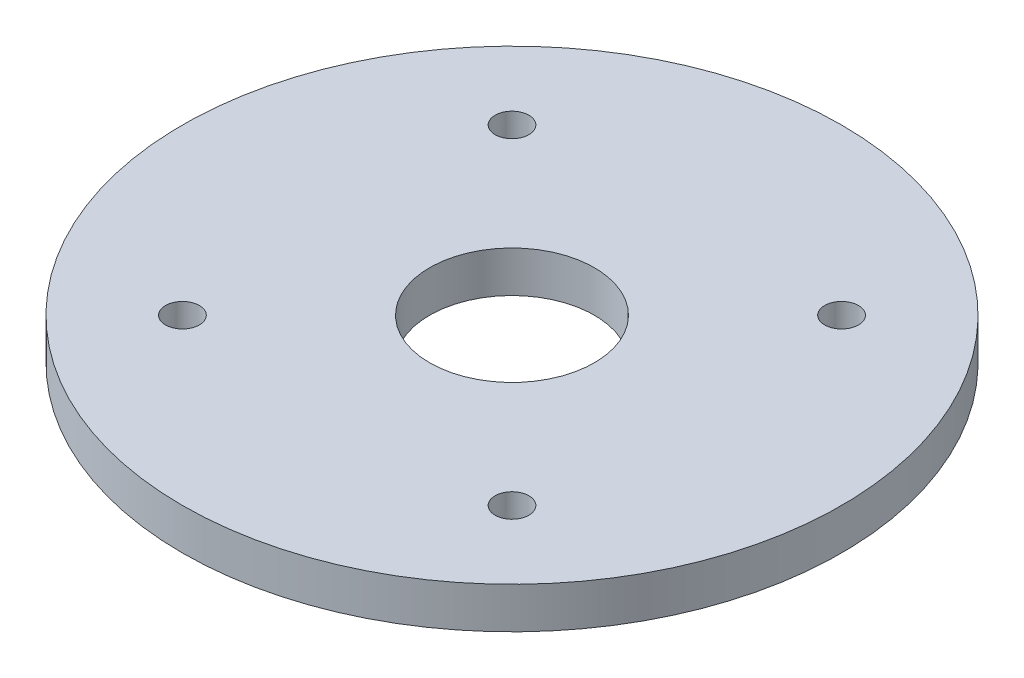
ISO-10303-21;
HEADER;
FILE_DESCRIPTION(('STEP AP214'),'2;1');
FILE_NAME('part.step','',(''),(''),'','','');
FILE_SCHEMA(('AUTOMOTIVE_DESIGN { 1 0 10303 214 1 1 1 1 }'));
ENDSEC;
DATA;
#1=APPLICATION_CONTEXT('core data for automotive mechanical design processes');
#2=APPLICATION_PROTOCOL_DEFINITION('international standard','automotive_design',2000,#1);
#3=PRODUCT_CONTEXT('',#1,'mechanical');
#4=PRODUCT('Part','Part','',(#3));
#5=PRODUCT_RELATED_PRODUCT_CATEGORY('part','',(#4));
#6=PRODUCT_DEFINITION_FORMATION('','',#4);
#7=PRODUCT_DEFINITION_CONTEXT('part definition',#1,'design');
#8=PRODUCT_DEFINITION('design','',#6,#7);
#9=PRODUCT_DEFINITION_SHAPE('','',#8);
#10=(LENGTH_UNIT() NAMED_UNIT(*) SI_UNIT(.MILLI.,.METRE.));
#11=(NAMED_UNIT(*) PLANE_ANGLE_UNIT() SI_UNIT($,.RADIAN.));
#12=(NAMED_UNIT(*) SI_UNIT($,.STERADIAN.) SOLID_ANGLE_UNIT());
#13=UNCERTAINTY_MEASURE_WITH_UNIT(LENGTH_MEASURE(1.E-05),#10,'distance_accuracy_value','');
#14=(GEOMETRIC_REPRESENTATION_CONTEXT(3) GLOBAL_UNCERTAINTY_ASSIGNED_CONTEXT((#13)) GLOBAL_UNIT_ASSIGNED_CONTEXT((#10,
#11,#12)) REPRESENTATION_CONTEXT('',''));
#15=CARTESIAN_POINT('',(0.,0.,0.));
#16=DIRECTION('',(0.,0.,1.));
#17=DIRECTION('',(1.,0.,0.));
#18=AXIS2_PLACEMENT_3D('',#15,#16,#17);
#19=CARTESIAN_POINT('',(0.,2.5,0.));
#20=DIRECTION('',(0.,1.,0.));
#21=DIRECTION('',(0.,0.,1.));
#22=AXIS2_PLACEMENT_3D('',#19,#20,#21);
#23=PLANE('',#22);
#24=CARTESIAN_POINT('',(-10.,2.5,-10.));
#25=DIRECTION('',(0.,1.,0.));
#26=DIRECTION('',(0.,0.,1.));
#27=AXIS2_PLACEMENT_3D('',#24,#25,#26);
#28=CIRCLE('',#27,1.025);
#29=CARTESIAN_POINT('',(-10.,2.5,-8.975));
#30=VERTEX_POINT('',#29);
#31=EDGE_CURVE('E73',#30,#30,#28,.T.);
#32=ORIENTED_EDGE('',*,*,#31,.F.);
#33=EDGE_LOOP('',(#32));
#34=FACE_BOUND('',#33,.T.);
#35=CARTESIAN_POINT('',(10.,2.5,-10.));
#36=DIRECTION('',(0.,1.,0.));
#37=DIRECTION('',(0.,0.,1.));
#38=AXIS2_PLACEMENT_3D('',#35,#36,#37);
#39=CIRCLE('',#38,1.025);
#40=CARTESIAN_POINT('',(10.,2.5,-8.975));
#41=VERTEX_POINT('',#40);
#42=EDGE_CURVE('E67',#41,#41,#39,.T.);
#43=ORIENTED_EDGE('',*,*,#42,.F.);
#44=EDGE_LOOP('',(#43));
#45=FACE_BOUND('',#44,.T.);
#46=CARTESIAN_POINT('',(10.,2.5,10.));
#47=DIRECTION('',(0.,1.,0.));
#48=DIRECTION('',(0.,0.,1.));
#49=AXIS2_PLACEMENT_3D('',#46,#47,#48);
#50=CIRCLE('',#49,1.025);
#51=CARTESIAN_POINT('',(10.,2.5,11.025));
#52=VERTEX_POINT('',#51);
#53=EDGE_CURVE('E61',#52,#52,#50,.T.);
#54=ORIENTED_EDGE('',*,*,#53,.F.);
#55=EDGE_LOOP('',(#54));
#56=FACE_BOUND('',#55,.T.);
#57=CARTESIAN_POINT('',(-10.,2.5,10.));
#58=DIRECTION('',(0.,1.,0.));
#59=DIRECTION('',(0.,0.,1.));
#60=AXIS2_PLACEMENT_3D('',#57,#58,#59);
#61=CIRCLE('',#60,1.025);
#62=CARTESIAN_POINT('',(-10.,2.5,11.025));
#63=VERTEX_POINT('',#62);
#64=EDGE_CURVE('E55',#63,#63,#61,.T.);
#65=ORIENTED_EDGE('',*,*,#64,.F.);
#66=EDGE_LOOP('',(#65));
#67=FACE_BOUND('',#66,.T.);
#68=CARTESIAN_POINT('',(0.,2.5,0.));
#69=DIRECTION('',(0.,1.,0.));
#70=DIRECTION('',(0.,0.,1.));
#71=AXIS2_PLACEMENT_3D('',#68,#69,#70);
#72=CIRCLE('',#71,20.);
#73=CARTESIAN_POINT('',(0.,2.5,20.));
#74=VERTEX_POINT('',#73);
#75=EDGE_CURVE('E10',#74,#74,#72,.T.);
#76=ORIENTED_EDGE('',*,*,#75,.T.);
#77=EDGE_LOOP('',(#76));
#78=FACE_BOUND('',#77,.T.);
#79=CARTESIAN_POINT('',(0.,2.5,0.));
#80=DIRECTION('',(0.,1.,0.));
#81=DIRECTION('',(0.,0.,1.));
#82=AXIS2_PLACEMENT_3D('',#79,#80,#81);
#83=CIRCLE('',#82,5.);
#84=CARTESIAN_POINT('',(0.,2.5,5.));
#85=VERTEX_POINT('',#84);
#86=EDGE_CURVE('E45',#85,#85,#83,.T.);
#87=ORIENTED_EDGE('',*,*,#86,.F.);
#88=EDGE_LOOP('',(#87));
#89=FACE_BOUND('',#88,.T.);
#90=ADVANCED_FACE('F34',(#34,#45,#56,#67,#78,#89),#23,.T.);
#91=CARTESIAN_POINT('',(0.,0.,0.));
#92=DIRECTION('',(0.,1.,0.));
#93=DIRECTION('',(0.,0.,1.));
#94=AXIS2_PLACEMENT_3D('',#91,#92,#93);
#95=PLANE('',#94);
#96=CARTESIAN_POINT('',(-10.,0.,-10.));
#97=DIRECTION('',(0.,1.,0.));
#98=DIRECTION('',(0.,0.,1.));
#99=AXIS2_PLACEMENT_3D('',#96,#97,#98);
#100=CIRCLE('',#99,1.025);
#101=CARTESIAN_POINT('',(-10.,0.,-8.975));
#102=VERTEX_POINT('',#101);
#103=EDGE_CURVE('E70',#102,#102,#100,.T.);
#104=ORIENTED_EDGE('',*,*,#103,.T.);
#105=EDGE_LOOP('',(#104));
#106=FACE_BOUND('',#105,.T.);
#107=CARTESIAN_POINT('',(10.,0.,-10.));
#108=DIRECTION('',(0.,1.,0.));
#109=DIRECTION('',(0.,0.,1.));
#110=AXIS2_PLACEMENT_3D('',#107,#108,#109);
#111=CIRCLE('',#110,1.025);
#112=CARTESIAN_POINT('',(10.,0.,-8.975));
#113=VERTEX_POINT('',#112);
#114=EDGE_CURVE('E64',#113,#113,#111,.T.);
#115=ORIENTED_EDGE('',*,*,#114,.T.);
#116=EDGE_LOOP('',(#115));
#117=FACE_BOUND('',#116,.T.);
#118=CARTESIAN_POINT('',(10.,0.,10.));
#119=DIRECTION('',(0.,1.,0.));
#120=DIRECTION('',(0.,0.,1.));
#121=AXIS2_PLACEMENT_3D('',#118,#119,#120);
#122=CIRCLE('',#121,1.025);
#123=CARTESIAN_POINT('',(10.,0.,11.025));
#124=VERTEX_POINT('',#123);
#125=EDGE_CURVE('E58',#124,#124,#122,.T.);
#126=ORIENTED_EDGE('',*,*,#125,.T.);
#127=EDGE_LOOP('',(#126));
#128=FACE_BOUND('',#127,.T.);
#129=CARTESIAN_POINT('',(-10.,0.,10.));
#130=DIRECTION('',(0.,1.,0.));
#131=DIRECTION('',(0.,0.,1.));
#132=AXIS2_PLACEMENT_3D('',#129,#130,#131);
#133=CIRCLE('',#132,1.025);
#134=CARTESIAN_POINT('',(-10.,0.,11.025));
#135=VERTEX_POINT('',#134);
#136=EDGE_CURVE('E50',#135,#135,#133,.T.);
#137=ORIENTED_EDGE('',*,*,#136,.T.);
#138=EDGE_LOOP('',(#137));
#139=FACE_BOUND('',#138,.T.);
#140=CARTESIAN_POINT('',(0.,0.,0.));
#141=DIRECTION('',(0.,1.,0.));
#142=DIRECTION('',(0.,0.,1.));
#143=AXIS2_PLACEMENT_3D('',#140,#141,#142);
#144=CIRCLE('',#143,20.);
#145=CARTESIAN_POINT('',(0.,0.,20.));
#146=VERTEX_POINT('',#145);
#147=EDGE_CURVE('E38',#146,#146,#144,.T.);
#148=ORIENTED_EDGE('',*,*,#147,.F.);
#149=EDGE_LOOP('',(#148));
#150=FACE_BOUND('',#149,.T.);
#151=CARTESIAN_POINT('',(0.,0.,0.));
#152=DIRECTION('',(0.,1.,0.));
#153=DIRECTION('',(0.,0.,1.));
#154=AXIS2_PLACEMENT_3D('',#151,#152,#153);
#155=CIRCLE('',#154,5.);
#156=CARTESIAN_POINT('',(0.,0.,5.));
#157=VERTEX_POINT('',#156);
#158=EDGE_CURVE('E47',#157,#157,#155,.T.);
#159=ORIENTED_EDGE('',*,*,#158,.T.);
#160=EDGE_LOOP('',(#159));
#161=FACE_BOUND('',#160,.T.);
#162=ADVANCED_FACE('F81',(#106,#117,#128,#139,#150,#161),#95,.F.);
#163=CARTESIAN_POINT('',(0.,2.5,0.));
#164=DIRECTION('',(0.,-1.,0.));
#165=DIRECTION('',(0.,0.,-1.));
#166=AXIS2_PLACEMENT_3D('',#163,#164,#165);
#167=CYLINDRICAL_SURFACE('',#166,20.);
#168=ORIENTED_EDGE('',*,*,#75,.F.);
#169=EDGE_LOOP('',(#168));
#170=FACE_BOUND('',#169,.T.);
#171=ORIENTED_EDGE('',*,*,#147,.T.);
#172=EDGE_LOOP('',(#171));
#173=FACE_BOUND('',#172,.T.);
#174=ADVANCED_FACE('F36',(#170,#173),#167,.T.);
#175=CARTESIAN_POINT('',(0.,2.5,0.));
#176=DIRECTION('',(0.,-1.,0.));
#177=DIRECTION('',(0.,0.,-1.));
#178=AXIS2_PLACEMENT_3D('',#175,#176,#177);
#179=CYLINDRICAL_SURFACE('',#178,5.);
#180=ORIENTED_EDGE('',*,*,#86,.T.);
#181=EDGE_LOOP('',(#180));
#182=FACE_BOUND('',#181,.T.);
#183=ORIENTED_EDGE('',*,*,#158,.F.);
#184=EDGE_LOOP('',(#183));
#185=FACE_BOUND('',#184,.T.);
#186=ADVANCED_FACE('F91',(#182,#185),#179,.F.);
#187=CARTESIAN_POINT('',(-10.,2.5,10.));
#188=DIRECTION('',(0.,1.,0.));
#189=DIRECTION('',(0.,0.,1.));
#190=AXIS2_PLACEMENT_3D('',#187,#188,#189);
#191=CYLINDRICAL_SURFACE('',#190,1.025);
#192=ORIENTED_EDGE('',*,*,#136,.F.);
#193=EDGE_LOOP('',(#192));
#194=FACE_BOUND('',#193,.T.);
#195=ORIENTED_EDGE('',*,*,#64,.T.);
#196=EDGE_LOOP('',(#195));
#197=FACE_BOUND('',#196,.T.);
#198=ADVANCED_FACE('F94',(#194,#197),#191,.F.);
#199=CARTESIAN_POINT('',(10.,2.5,10.));
#200=DIRECTION('',(0.,1.,0.));
#201=DIRECTION('',(0.,0.,1.));
#202=AXIS2_PLACEMENT_3D('',#199,#200,#201);
#203=CYLINDRICAL_SURFACE('',#202,1.025);
#204=ORIENTED_EDGE('',*,*,#125,.F.);
#205=EDGE_LOOP('',(#204));
#206=FACE_BOUND('',#205,.T.);
#207=ORIENTED_EDGE('',*,*,#53,.T.);
#208=EDGE_LOOP('',(#207));
#209=FACE_BOUND('',#208,.T.);
#210=ADVANCED_FACE('F108',(#206,#209),#203,.F.);
#211=CARTESIAN_POINT('',(10.,2.5,-10.));
#212=DIRECTION('',(0.,1.,0.));
#213=DIRECTION('',(0.,0.,1.));
#214=AXIS2_PLACEMENT_3D('',#211,#212,#213);
#215=CYLINDRICAL_SURFACE('',#214,1.025);
#216=ORIENTED_EDGE('',*,*,#114,.F.);
#217=EDGE_LOOP('',(#216));
#218=FACE_BOUND('',#217,.T.);
#219=ORIENTED_EDGE('',*,*,#42,.T.);
#220=EDGE_LOOP('',(#219));
#221=FACE_BOUND('',#220,.T.);
#222=ADVANCED_FACE('F112',(#218,#221),#215,.F.);
#223=CARTESIAN_POINT('',(-10.,2.5,-10.));
#224=DIRECTION('',(0.,1.,0.));
#225=DIRECTION('',(0.,0.,1.));
#226=AXIS2_PLACEMENT_3D('',#223,#224,#225);
#227=CYLINDRICAL_SURFACE('',#226,1.025);
#228=ORIENTED_EDGE('',*,*,#103,.F.);
#229=EDGE_LOOP('',(#228));
#230=FACE_BOUND('',#229,.T.);
#231=ORIENTED_EDGE('',*,*,#31,.T.);
#232=EDGE_LOOP('',(#231));
#233=FACE_BOUND('',#232,.T.);
#234=ADVANCED_FACE('F77',(#230,#233),#227,.F.);
#235=CLOSED_SHELL('',(#90,#162,#174,#186,#198,#210,#222,#234));
#236=MANIFOLD_SOLID_BREP('B2',#235);
#237=ADVANCED_BREP_SHAPE_REPRESENTATION('',(#18,#236),#14);
#238=SHAPE_DEFINITION_REPRESENTATION(#9,#237);
ENDSEC;
END-ISO-10303-21;
